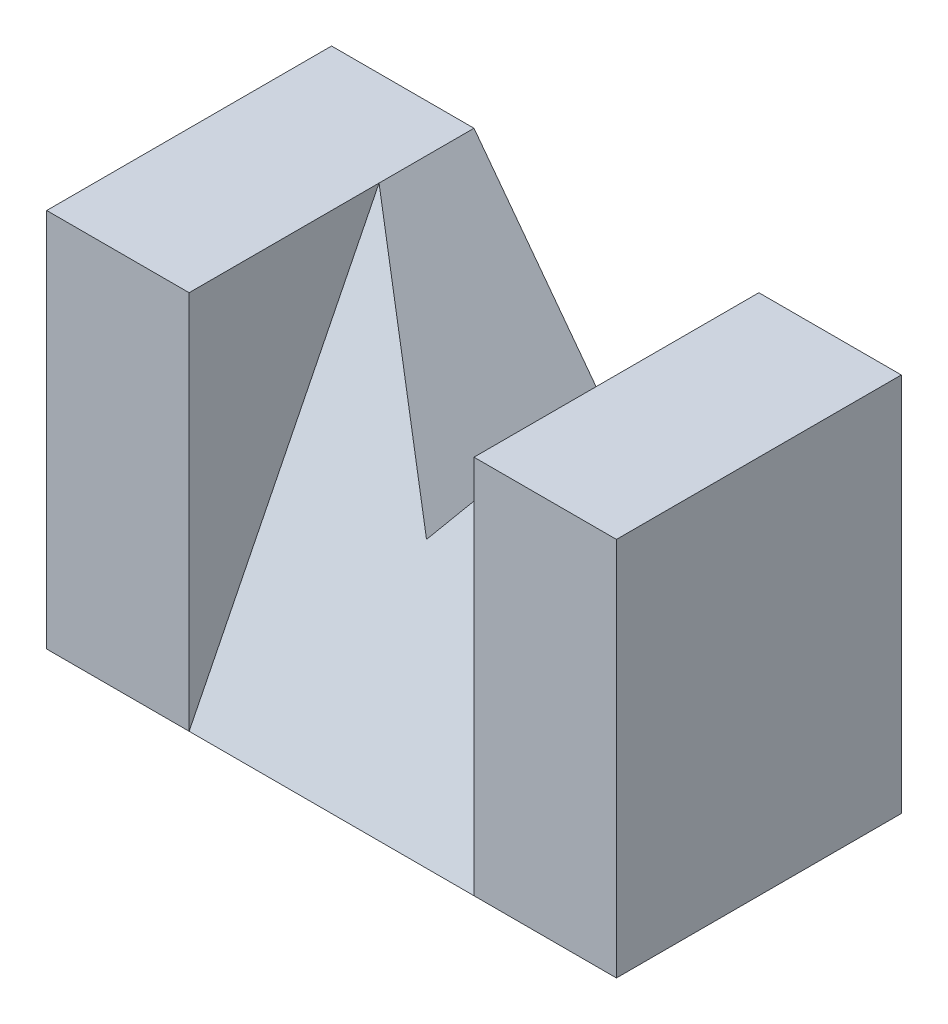
ISO-10303-21;
HEADER;
FILE_DESCRIPTION(('STEP AP214'),'2;1');
FILE_NAME('part.step','',(''),(''),'','','');
FILE_SCHEMA(('AUTOMOTIVE_DESIGN { 1 0 10303 214 1 1 1 1 }'));
ENDSEC;
DATA;
#1=APPLICATION_CONTEXT('core data for automotive mechanical design processes');
#2=APPLICATION_PROTOCOL_DEFINITION('international standard','automotive_design',2000,#1);
#3=PRODUCT_CONTEXT('',#1,'mechanical');
#4=PRODUCT('Part','Part','',(#3));
#5=PRODUCT_RELATED_PRODUCT_CATEGORY('part','',(#4));
#6=PRODUCT_DEFINITION_FORMATION('','',#4);
#7=PRODUCT_DEFINITION_CONTEXT('part definition',#1,'design');
#8=PRODUCT_DEFINITION('design','',#6,#7);
#9=PRODUCT_DEFINITION_SHAPE('','',#8);
#10=(LENGTH_UNIT() NAMED_UNIT(*) SI_UNIT(.MILLI.,.METRE.));
#11=(NAMED_UNIT(*) PLANE_ANGLE_UNIT() SI_UNIT($,.RADIAN.));
#12=(NAMED_UNIT(*) SI_UNIT($,.STERADIAN.) SOLID_ANGLE_UNIT());
#13=UNCERTAINTY_MEASURE_WITH_UNIT(LENGTH_MEASURE(1.E-05),#10,'distance_accuracy_value','');
#14=(GEOMETRIC_REPRESENTATION_CONTEXT(3) GLOBAL_UNCERTAINTY_ASSIGNED_CONTEXT((#13)) GLOBAL_UNIT_ASSIGNED_CONTEXT((#10,
#11,#12)) REPRESENTATION_CONTEXT('',''));
#15=CARTESIAN_POINT('',(0.,0.,0.));
#16=DIRECTION('',(0.,0.,1.));
#17=DIRECTION('',(1.,0.,0.));
#18=AXIS2_PLACEMENT_3D('',#15,#16,#17);
#19=CARTESIAN_POINT('',(-30.,40.,0.));
#20=DIRECTION('',(0.,0.,-1.));
#21=DIRECTION('',(-1.,0.,0.));
#22=AXIS2_PLACEMENT_3D('',#19,#20,#21);
#23=PLANE('',#22);
#24=DIRECTION('',(0.,-1.,0.));
#25=VECTOR('',#24,1.);
#26=CARTESIAN_POINT('',(15.,0.,0.));
#27=LINE('',#26,#25);
#28=CARTESIAN_POINT('',(15.,40.,0.));
#29=VERTEX_POINT('',#28);
#30=CARTESIAN_POINT('',(15.,0.,0.));
#31=VERTEX_POINT('',#30);
#32=EDGE_CURVE('E206',#29,#31,#27,.T.);
#33=ORIENTED_EDGE('',*,*,#32,.T.);
#34=DIRECTION('',(1.,0.,0.));
#35=VECTOR('',#34,1.);
#36=CARTESIAN_POINT('',(-30.,0.,0.));
#37=LINE('',#36,#35);
#38=CARTESIAN_POINT('',(30.,0.,0.));
#39=VERTEX_POINT('',#38);
#40=EDGE_CURVE('E129',#31,#39,#37,.T.);
#41=ORIENTED_EDGE('',*,*,#40,.T.);
#42=DIRECTION('',(0.,-1.,0.));
#43=VECTOR('',#42,1.);
#44=CARTESIAN_POINT('',(30.,40.,0.));
#45=LINE('',#44,#43);
#46=CARTESIAN_POINT('',(30.,40.,0.));
#47=VERTEX_POINT('',#46);
#48=EDGE_CURVE('E152',#47,#39,#45,.T.);
#49=ORIENTED_EDGE('',*,*,#48,.F.);
#50=DIRECTION('',(1.,0.,0.));
#51=VECTOR('',#50,1.);
#52=CARTESIAN_POINT('',(-30.,40.,0.));
#53=LINE('',#52,#51);
#54=EDGE_CURVE('E172',#29,#47,#53,.T.);
#55=ORIENTED_EDGE('',*,*,#54,.F.);
#56=EDGE_LOOP('',(#33,#41,#49,#55));
#57=FACE_BOUND('',#56,.T.);
#58=ADVANCED_FACE('F37',(#57),#23,.F.);
#59=CARTESIAN_POINT('',(0.,40.,0.));
#60=DIRECTION('',(0.,-1.,0.));
#61=DIRECTION('',(0.,0.,-1.));
#62=AXIS2_PLACEMENT_3D('',#59,#60,#61);
#63=PLANE('',#62);
#64=DIRECTION('',(-1.,0.,0.));
#65=VECTOR('',#64,1.);
#66=CARTESIAN_POINT('',(-30.,40.,-30.));
#67=LINE('',#66,#65);
#68=CARTESIAN_POINT('',(30.,40.,-30.));
#69=VERTEX_POINT('',#68);
#70=CARTESIAN_POINT('',(15.,40.,-30.));
#71=VERTEX_POINT('',#70);
#72=EDGE_CURVE('E149',#69,#71,#67,.T.);
#73=ORIENTED_EDGE('',*,*,#72,.T.);
#74=DIRECTION('',(0.,0.,1.));
#75=VECTOR('',#74,1.);
#76=CARTESIAN_POINT('',(15.,40.,-30.));
#77=LINE('',#76,#75);
#78=CARTESIAN_POINT('',(15.,40.,-20.));
#79=VERTEX_POINT('',#78);
#80=EDGE_CURVE('E193',#71,#79,#77,.T.);
#81=ORIENTED_EDGE('',*,*,#80,.T.);
#82=DIRECTION('',(0.,0.,1.));
#83=VECTOR('',#82,1.);
#84=CARTESIAN_POINT('',(15.,40.,0.));
#85=LINE('',#84,#83);
#86=EDGE_CURVE('E120',#79,#29,#85,.T.);
#87=ORIENTED_EDGE('',*,*,#86,.T.);
#88=ORIENTED_EDGE('',*,*,#54,.T.);
#89=DIRECTION('',(0.,0.,-1.));
#90=VECTOR('',#89,1.);
#91=CARTESIAN_POINT('',(30.,40.,0.));
#92=LINE('',#91,#90);
#93=EDGE_CURVE('E159',#47,#69,#92,.T.);
#94=ORIENTED_EDGE('',*,*,#93,.T.);
#95=EDGE_LOOP('',(#73,#81,#87,#88,#94));
#96=FACE_BOUND('',#95,.T.);
#97=ADVANCED_FACE('F200',(#96),#63,.F.);
#98=CARTESIAN_POINT('',(-30.,40.,0.));
#99=DIRECTION('',(1.,0.,0.));
#100=DIRECTION('',(0.,0.,-1.));
#101=AXIS2_PLACEMENT_3D('',#98,#99,#100);
#102=PLANE('',#101);
#103=DIRECTION('',(0.,0.,1.));
#104=VECTOR('',#103,1.);
#105=CARTESIAN_POINT('',(-30.,0.,0.));
#106=LINE('',#105,#104);
#107=CARTESIAN_POINT('',(-30.,0.,-30.));
#108=VERTEX_POINT('',#107);
#109=CARTESIAN_POINT('',(-30.,0.,0.));
#110=VERTEX_POINT('',#109);
#111=EDGE_CURVE('E139',#108,#110,#106,.T.);
#112=ORIENTED_EDGE('',*,*,#111,.T.);
#113=DIRECTION('',(0.,-1.,0.));
#114=VECTOR('',#113,1.);
#115=CARTESIAN_POINT('',(-30.,40.,0.));
#116=LINE('',#115,#114);
#117=CARTESIAN_POINT('',(-30.,40.,0.));
#118=VERTEX_POINT('',#117);
#119=EDGE_CURVE('E45',#118,#110,#116,.T.);
#120=ORIENTED_EDGE('',*,*,#119,.F.);
#121=DIRECTION('',(0.,0.,1.));
#122=VECTOR('',#121,1.);
#123=CARTESIAN_POINT('',(-30.,40.,0.));
#124=LINE('',#123,#122);
#125=CARTESIAN_POINT('',(-30.,40.,-30.));
#126=VERTEX_POINT('',#125);
#127=EDGE_CURVE('E144',#126,#118,#124,.T.);
#128=ORIENTED_EDGE('',*,*,#127,.F.);
#129=DIRECTION('',(0.,-1.,0.));
#130=VECTOR('',#129,1.);
#131=CARTESIAN_POINT('',(-30.,40.,-30.));
#132=LINE('',#131,#130);
#133=EDGE_CURVE('E145',#126,#108,#132,.T.);
#134=ORIENTED_EDGE('',*,*,#133,.T.);
#135=EDGE_LOOP('',(#112,#120,#128,#134));
#136=FACE_BOUND('',#135,.T.);
#137=ADVANCED_FACE('F39',(#136),#102,.F.);
#138=CARTESIAN_POINT('',(-15.,0.,0.));
#139=VERTEX_POINT('',#138);
#140=EDGE_CURVE('E126',#110,#139,#37,.T.);
#141=ORIENTED_EDGE('',*,*,#140,.T.);
#142=DIRECTION('',(0.,-1.,0.));
#143=VECTOR('',#142,1.);
#144=CARTESIAN_POINT('',(-15.,0.,0.));
#145=LINE('',#144,#143);
#146=CARTESIAN_POINT('',(-15.,40.,0.));
#147=VERTEX_POINT('',#146);
#148=EDGE_CURVE('E113',#147,#139,#145,.T.);
#149=ORIENTED_EDGE('',*,*,#148,.F.);
#150=EDGE_CURVE('E174',#118,#147,#53,.T.);
#151=ORIENTED_EDGE('',*,*,#150,.F.);
#152=ORIENTED_EDGE('',*,*,#119,.T.);
#153=EDGE_LOOP('',(#141,#149,#151,#152));
#154=FACE_BOUND('',#153,.T.);
#155=ADVANCED_FACE('F132',(#154),#23,.F.);
#156=CARTESIAN_POINT('',(30.,40.,0.));
#157=DIRECTION('',(-1.,0.,0.));
#158=DIRECTION('',(0.,0.,1.));
#159=AXIS2_PLACEMENT_3D('',#156,#157,#158);
#160=PLANE('',#159);
#161=DIRECTION('',(0.,0.,-1.));
#162=VECTOR('',#161,1.);
#163=CARTESIAN_POINT('',(30.,0.,0.));
#164=LINE('',#163,#162);
#165=CARTESIAN_POINT('',(30.,0.,-30.));
#166=VERTEX_POINT('',#165);
#167=EDGE_CURVE('E135',#39,#166,#164,.T.);
#168=ORIENTED_EDGE('',*,*,#167,.T.);
#169=DIRECTION('',(0.,-1.,0.));
#170=VECTOR('',#169,1.);
#171=CARTESIAN_POINT('',(30.,40.,-30.));
#172=LINE('',#171,#170);
#173=EDGE_CURVE('E148',#69,#166,#172,.T.);
#174=ORIENTED_EDGE('',*,*,#173,.F.);
#175=ORIENTED_EDGE('',*,*,#93,.F.);
#176=ORIENTED_EDGE('',*,*,#48,.T.);
#177=EDGE_LOOP('',(#168,#174,#175,#176));
#178=FACE_BOUND('',#177,.T.);
#179=ADVANCED_FACE('F157',(#178),#160,.F.);
#180=CARTESIAN_POINT('',(-30.,40.,-30.));
#181=DIRECTION('',(0.,0.,1.));
#182=DIRECTION('',(1.,0.,0.));
#183=AXIS2_PLACEMENT_3D('',#180,#181,#182);
#184=PLANE('',#183);
#185=DIRECTION('',(0.6,-0.8,0.));
#186=VECTOR('',#185,1.);
#187=CARTESIAN_POINT('',(-15.,40.,-30.));
#188=LINE('',#187,#186);
#189=CARTESIAN_POINT('',(-15.,40.,-30.));
#190=VERTEX_POINT('',#189);
#191=CARTESIAN_POINT('',(0.,20.,-30.));
#192=VERTEX_POINT('',#191);
#193=EDGE_CURVE('E60',#190,#192,#188,.T.);
#194=ORIENTED_EDGE('',*,*,#193,.T.);
#195=DIRECTION('',(0.6,0.8,0.));
#196=VECTOR('',#195,1.);
#197=CARTESIAN_POINT('',(0.,20.,-30.));
#198=LINE('',#197,#196);
#199=EDGE_CURVE('E187',#192,#71,#198,.T.);
#200=ORIENTED_EDGE('',*,*,#199,.T.);
#201=ORIENTED_EDGE('',*,*,#72,.F.);
#202=ORIENTED_EDGE('',*,*,#173,.T.);
#203=DIRECTION('',(-1.,0.,0.));
#204=VECTOR('',#203,1.);
#205=CARTESIAN_POINT('',(-30.,0.,-30.));
#206=LINE('',#205,#204);
#207=EDGE_CURVE('E137',#166,#108,#206,.T.);
#208=ORIENTED_EDGE('',*,*,#207,.T.);
#209=ORIENTED_EDGE('',*,*,#133,.F.);
#210=EDGE_CURVE('E180',#190,#126,#67,.T.);
#211=ORIENTED_EDGE('',*,*,#210,.F.);
#212=EDGE_LOOP('',(#194,#200,#201,#202,#208,#209,#211));
#213=FACE_BOUND('',#212,.T.);
#214=ADVANCED_FACE('F165',(#213),#184,.F.);
#215=ORIENTED_EDGE('',*,*,#150,.T.);
#216=DIRECTION('',(0.,0.,1.));
#217=VECTOR('',#216,1.);
#218=CARTESIAN_POINT('',(-15.,40.,0.));
#219=LINE('',#218,#217);
#220=CARTESIAN_POINT('',(-15.,40.,-20.));
#221=VERTEX_POINT('',#220);
#222=EDGE_CURVE('E112',#221,#147,#219,.T.);
#223=ORIENTED_EDGE('',*,*,#222,.F.);
#224=DIRECTION('',(0.,0.,1.));
#225=VECTOR('',#224,1.);
#226=CARTESIAN_POINT('',(-15.,40.,-30.));
#227=LINE('',#226,#225);
#228=EDGE_CURVE('E177',#190,#221,#227,.T.);
#229=ORIENTED_EDGE('',*,*,#228,.F.);
#230=ORIENTED_EDGE('',*,*,#210,.T.);
#231=ORIENTED_EDGE('',*,*,#127,.T.);
#232=EDGE_LOOP('',(#215,#223,#229,#230,#231));
#233=FACE_BOUND('',#232,.T.);
#234=ADVANCED_FACE('F184',(#233),#63,.F.);
#235=CARTESIAN_POINT('',(0.,0.,0.));
#236=DIRECTION('',(0.,-1.,0.));
#237=DIRECTION('',(0.,0.,-1.));
#238=AXIS2_PLACEMENT_3D('',#235,#236,#237);
#239=PLANE('',#238);
#240=ORIENTED_EDGE('',*,*,#111,.F.);
#241=ORIENTED_EDGE('',*,*,#207,.F.);
#242=ORIENTED_EDGE('',*,*,#167,.F.);
#243=ORIENTED_EDGE('',*,*,#40,.F.);
#244=DIRECTION('',(1.,0.,0.));
#245=VECTOR('',#244,1.);
#246=CARTESIAN_POINT('',(-15.,0.,0.));
#247=LINE('',#246,#245);
#248=EDGE_CURVE('E109',#139,#31,#247,.T.);
#249=ORIENTED_EDGE('',*,*,#248,.F.);
#250=ORIENTED_EDGE('',*,*,#140,.F.);
#251=EDGE_LOOP('',(#240,#241,#242,#243,#249,#250));
#252=FACE_BOUND('',#251,.T.);
#253=ADVANCED_FACE('F125',(#252),#239,.T.);
#254=CARTESIAN_POINT('',(0.,20.,-30.));
#255=DIRECTION('',(0.8,-0.6,0.));
#256=DIRECTION('',(0.6,0.8,0.));
#257=AXIS2_PLACEMENT_3D('',#254,#255,#256);
#258=PLANE('',#257);
#259=DIRECTION('',(0.,0.,1.));
#260=VECTOR('',#259,1.);
#261=CARTESIAN_POINT('',(0.,20.,-30.));
#262=LINE('',#261,#260);
#263=CARTESIAN_POINT('',(0.,20.,-10.));
#264=VERTEX_POINT('',#263);
#265=EDGE_CURVE('E194',#192,#264,#262,.T.);
#266=ORIENTED_EDGE('',*,*,#265,.T.);
#267=DIRECTION('',(0.557086014531155,0.742781352708207,-0.371390676354104));
#268=VECTOR('',#267,1.);
#269=CARTESIAN_POINT('',(4.13793103448276,25.5172413793103,-12.7586206896552));
#270=LINE('',#269,#268);
#271=EDGE_CURVE('E130',#264,#79,#270,.T.);
#272=ORIENTED_EDGE('',*,*,#271,.T.);
#273=ORIENTED_EDGE('',*,*,#80,.F.);
#274=ORIENTED_EDGE('',*,*,#199,.F.);
#275=EDGE_LOOP('',(#266,#272,#273,#274));
#276=FACE_BOUND('',#275,.T.);
#277=ADVANCED_FACE('F198',(#276),#258,.F.);
#278=CARTESIAN_POINT('',(-15.,40.,-30.));
#279=DIRECTION('',(-0.8,-0.6,0.));
#280=DIRECTION('',(0.6,-0.8,0.));
#281=AXIS2_PLACEMENT_3D('',#278,#279,#280);
#282=PLANE('',#281);
#283=ORIENTED_EDGE('',*,*,#228,.T.);
#284=DIRECTION('',(0.557086014531155,-0.742781352708207,0.371390676354104));
#285=VECTOR('',#284,1.);
#286=CARTESIAN_POINT('',(-17.0689655172414,42.7586206896552,-21.3793103448276));
#287=LINE('',#286,#285);
#288=EDGE_CURVE('E11',#221,#264,#287,.T.);
#289=ORIENTED_EDGE('',*,*,#288,.T.);
#290=ORIENTED_EDGE('',*,*,#265,.F.);
#291=ORIENTED_EDGE('',*,*,#193,.F.);
#292=EDGE_LOOP('',(#283,#289,#290,#291));
#293=FACE_BOUND('',#292,.T.);
#294=ADVANCED_FACE('F197',(#293),#282,.F.);
#295=CARTESIAN_POINT('',(-15.,40.,-20.));
#296=DIRECTION('',(0.,-0.447213595499958,-0.894427190999916));
#297=DIRECTION('',(0.,0.894427190999916,-0.447213595499958));
#298=AXIS2_PLACEMENT_3D('',#295,#296,#297);
#299=PLANE('',#298);
#300=ORIENTED_EDGE('',*,*,#288,.F.);
#301=DIRECTION('',(0.,0.894427190999916,-0.447213595499958));
#302=VECTOR('',#301,1.);
#303=CARTESIAN_POINT('',(-15.,40.,-20.));
#304=LINE('',#303,#302);
#305=EDGE_CURVE('E52',#139,#221,#304,.T.);
#306=ORIENTED_EDGE('',*,*,#305,.F.);
#307=ORIENTED_EDGE('',*,*,#248,.T.);
#308=DIRECTION('',(0.,0.894427190999916,-0.447213595499958));
#309=VECTOR('',#308,1.);
#310=CARTESIAN_POINT('',(15.,40.,-20.));
#311=LINE('',#310,#309);
#312=EDGE_CURVE('E203',#31,#79,#311,.T.);
#313=ORIENTED_EDGE('',*,*,#312,.T.);
#314=ORIENTED_EDGE('',*,*,#271,.F.);
#315=EDGE_LOOP('',(#300,#306,#307,#313,#314));
#316=FACE_BOUND('',#315,.T.);
#317=ADVANCED_FACE('F107',(#316),#299,.F.);
#318=CARTESIAN_POINT('',(-15.,0.,0.));
#319=DIRECTION('',(-1.,0.,0.));
#320=DIRECTION('',(0.,0.,1.));
#321=AXIS2_PLACEMENT_3D('',#318,#319,#320);
#322=PLANE('',#321);
#323=ORIENTED_EDGE('',*,*,#148,.T.);
#324=ORIENTED_EDGE('',*,*,#305,.T.);
#325=ORIENTED_EDGE('',*,*,#222,.T.);
#326=EDGE_LOOP('',(#323,#324,#325));
#327=FACE_BOUND('',#326,.T.);
#328=ADVANCED_FACE('F116',(#327),#322,.F.);
#329=CARTESIAN_POINT('',(15.,0.,0.));
#330=DIRECTION('',(-1.,0.,0.));
#331=DIRECTION('',(0.,0.,1.));
#332=AXIS2_PLACEMENT_3D('',#329,#330,#331);
#333=PLANE('',#332);
#334=ORIENTED_EDGE('',*,*,#32,.F.);
#335=ORIENTED_EDGE('',*,*,#86,.F.);
#336=ORIENTED_EDGE('',*,*,#312,.F.);
#337=EDGE_LOOP('',(#334,#335,#336));
#338=FACE_BOUND('',#337,.T.);
#339=ADVANCED_FACE('F210',(#338),#333,.T.);
#340=CLOSED_SHELL('',(#58,#97,#137,#155,#179,#214,#234,#253,#277,#294,#317,#328,#339));
#341=MANIFOLD_SOLID_BREP('B2',#340);
#342=ADVANCED_BREP_SHAPE_REPRESENTATION('',(#18,#341),#14);
#343=SHAPE_DEFINITION_REPRESENTATION(#9,#342);
ENDSEC;
END-ISO-10303-21;
